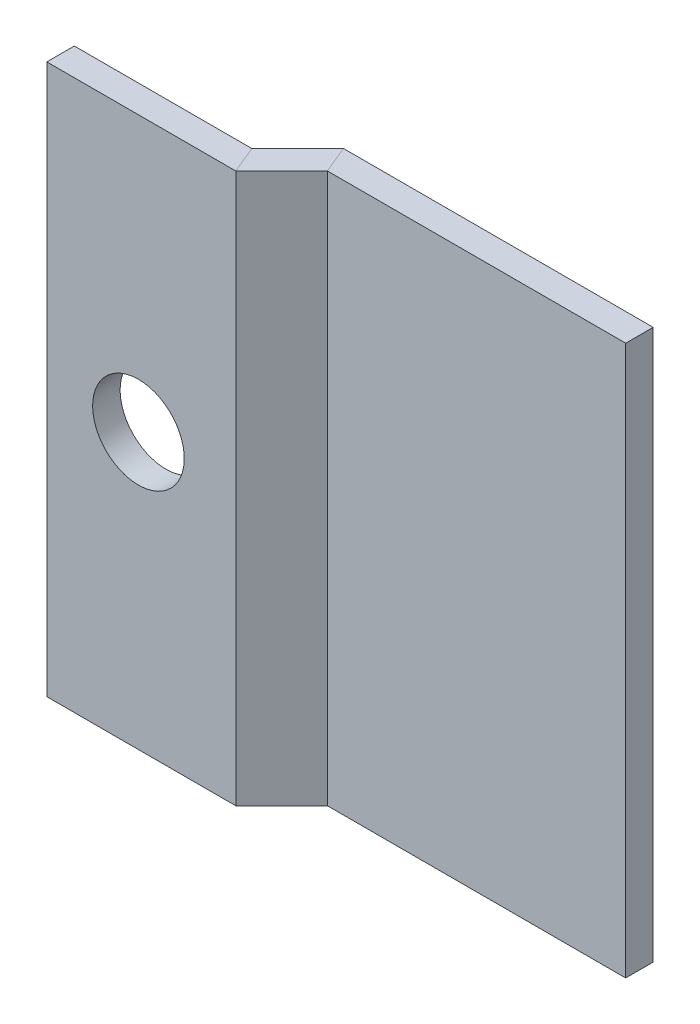
ISO-10303-21;
HEADER;
FILE_DESCRIPTION(('STEP AP214'),'2;1');
FILE_NAME('part.step','',(''),(''),'','','');
FILE_SCHEMA(('AUTOMOTIVE_DESIGN { 1 0 10303 214 1 1 1 1 }'));
ENDSEC;
DATA;
#1=APPLICATION_CONTEXT('core data for automotive mechanical design processes');
#2=APPLICATION_PROTOCOL_DEFINITION('international standard','automotive_design',2000,#1);
#3=PRODUCT_CONTEXT('',#1,'mechanical');
#4=PRODUCT('Part','Part','',(#3));
#5=PRODUCT_RELATED_PRODUCT_CATEGORY('part','',(#4));
#6=PRODUCT_DEFINITION_FORMATION('','',#4);
#7=PRODUCT_DEFINITION_CONTEXT('part definition',#1,'design');
#8=PRODUCT_DEFINITION('design','',#6,#7);
#9=PRODUCT_DEFINITION_SHAPE('','',#8);
#10=(LENGTH_UNIT() NAMED_UNIT(*) SI_UNIT(.MILLI.,.METRE.));
#11=(NAMED_UNIT(*) PLANE_ANGLE_UNIT() SI_UNIT($,.RADIAN.));
#12=(NAMED_UNIT(*) SI_UNIT($,.STERADIAN.) SOLID_ANGLE_UNIT());
#13=UNCERTAINTY_MEASURE_WITH_UNIT(LENGTH_MEASURE(1.E-05),#10,'distance_accuracy_value','');
#14=(GEOMETRIC_REPRESENTATION_CONTEXT(3) GLOBAL_UNCERTAINTY_ASSIGNED_CONTEXT((#13)) GLOBAL_UNIT_ASSIGNED_CONTEXT((#10,
#11,#12)) REPRESENTATION_CONTEXT('',''));
#15=CARTESIAN_POINT('',(0.,0.,0.));
#16=DIRECTION('',(0.,0.,1.));
#17=DIRECTION('',(1.,0.,0.));
#18=AXIS2_PLACEMENT_3D('',#15,#16,#17);
#19=CARTESIAN_POINT('',(11.6355449657061,0.,-1.));
#20=DIRECTION('',(1.,0.,0.));
#21=DIRECTION('',(0.,0.,-1.));
#22=AXIS2_PLACEMENT_3D('',#19,#20,#21);
#23=PLANE('',#22);
#24=DIRECTION('',(0.,1.,0.));
#25=VECTOR('',#24,1.);
#26=CARTESIAN_POINT('',(11.6355449657061,5.99999999999999,-1.3));
#27=LINE('',#26,#25);
#28=CARTESIAN_POINT('',(11.6355449657061,-6.00000000000001,-1.3));
#29=VERTEX_POINT('',#28);
#30=CARTESIAN_POINT('',(11.6355449657061,5.99999999999999,-1.3));
#31=VERTEX_POINT('',#30);
#32=EDGE_CURVE('E84',#29,#31,#27,.T.);
#33=ORIENTED_EDGE('',*,*,#32,.T.);
#34=DIRECTION('',(0.,0.,1.));
#35=VECTOR('',#34,1.);
#36=CARTESIAN_POINT('',(11.6355449657061,5.99999999999999,-0.7));
#37=LINE('',#36,#35);
#38=CARTESIAN_POINT('',(11.6355449657061,5.99999999999999,-0.7));
#39=VERTEX_POINT('',#38);
#40=EDGE_CURVE('E82',#31,#39,#37,.T.);
#41=ORIENTED_EDGE('',*,*,#40,.T.);
#42=DIRECTION('',(0.,-1.,0.));
#43=VECTOR('',#42,1.);
#44=CARTESIAN_POINT('',(11.6355449657061,5.99999999999999,-0.7));
#45=LINE('',#44,#43);
#46=CARTESIAN_POINT('',(11.6355449657061,-6.00000000000001,-0.700000000000001));
#47=VERTEX_POINT('',#46);
#48=EDGE_CURVE('E79',#39,#47,#45,.T.);
#49=ORIENTED_EDGE('',*,*,#48,.T.);
#50=DIRECTION('',(0.,0.,-1.));
#51=VECTOR('',#50,1.);
#52=CARTESIAN_POINT('',(11.6355449657061,-6.00000000000001,-0.700000000000001));
#53=LINE('',#52,#51);
#54=EDGE_CURVE('E99',#47,#29,#53,.T.);
#55=ORIENTED_EDGE('',*,*,#54,.T.);
#56=EDGE_LOOP('',(#33,#41,#49,#55));
#57=FACE_BOUND('',#56,.T.);
#58=ADVANCED_FACE('F33',(#57),#23,.T.);
#59=CARTESIAN_POINT('',(0.,0.,0.));
#60=DIRECTION('',(1.,0.,0.));
#61=DIRECTION('',(0.,0.,-1.));
#62=AXIS2_PLACEMENT_3D('',#59,#60,#61);
#63=PLANE('',#62);
#64=DIRECTION('',(0.,1.,0.));
#65=VECTOR('',#64,1.);
#66=CARTESIAN_POINT('',(0.,5.99999999999999,-0.299999999999999));
#67=LINE('',#66,#65);
#68=CARTESIAN_POINT('',(0.,-6.00000000000001,-0.300000000000001));
#69=VERTEX_POINT('',#68);
#70=CARTESIAN_POINT('',(0.,5.99999999999999,-0.299999999999999));
#71=VERTEX_POINT('',#70);
#72=EDGE_CURVE('E141',#69,#71,#67,.T.);
#73=ORIENTED_EDGE('',*,*,#72,.F.);
#74=DIRECTION('',(0.,0.,-1.));
#75=VECTOR('',#74,1.);
#76=CARTESIAN_POINT('',(0.,-6.00000000000001,0.299999999999999));
#77=LINE('',#76,#75);
#78=CARTESIAN_POINT('',(0.,-6.00000000000001,0.299999999999999));
#79=VERTEX_POINT('',#78);
#80=EDGE_CURVE('E147',#79,#69,#77,.T.);
#81=ORIENTED_EDGE('',*,*,#80,.F.);
#82=DIRECTION('',(0.,-1.,0.));
#83=VECTOR('',#82,1.);
#84=CARTESIAN_POINT('',(0.,5.99999999999999,0.3));
#85=LINE('',#84,#83);
#86=CARTESIAN_POINT('',(0.,5.99999999999999,0.3));
#87=VERTEX_POINT('',#86);
#88=EDGE_CURVE('E131',#87,#79,#85,.T.);
#89=ORIENTED_EDGE('',*,*,#88,.F.);
#90=DIRECTION('',(0.,0.,1.));
#91=VECTOR('',#90,1.);
#92=CARTESIAN_POINT('',(0.,5.99999999999999,0.3));
#93=LINE('',#92,#91);
#94=EDGE_CURVE('E137',#71,#87,#93,.T.);
#95=ORIENTED_EDGE('',*,*,#94,.F.);
#96=EDGE_LOOP('',(#73,#81,#89,#95));
#97=FACE_BOUND('',#96,.T.);
#98=ADVANCED_FACE('F212',(#97),#63,.F.);
#99=CARTESIAN_POINT('',(4.76330952441688,5.99999999999999,-0.7));
#100=DIRECTION('',(0.,0.,1.));
#101=DIRECTION('',(0.,-1.,0.));
#102=AXIS2_PLACEMENT_3D('',#99,#100,#101);
#103=PLANE('',#102);
#104=DIRECTION('',(0.,1.,0.));
#105=VECTOR('',#104,1.);
#106=CARTESIAN_POINT('',(5.12426406871193,5.99999999999999,-0.7));
#107=LINE('',#106,#105);
#108=CARTESIAN_POINT('',(5.12426406871193,-6.00000000000001,-0.700000000000001));
#109=VERTEX_POINT('',#108);
#110=CARTESIAN_POINT('',(5.12426406871193,5.99999999999999,-0.7));
#111=VERTEX_POINT('',#110);
#112=EDGE_CURVE('E115',#109,#111,#107,.T.);
#113=ORIENTED_EDGE('',*,*,#112,.F.);
#114=DIRECTION('',(1.,0.,0.));
#115=VECTOR('',#114,1.);
#116=CARTESIAN_POINT('',(4.76330952441688,-6.00000000000001,-0.700000000000001));
#117=LINE('',#116,#115);
#118=EDGE_CURVE('E97',#109,#47,#117,.T.);
#119=ORIENTED_EDGE('',*,*,#118,.T.);
#120=ORIENTED_EDGE('',*,*,#48,.F.);
#121=DIRECTION('',(1.,0.,0.));
#122=VECTOR('',#121,1.);
#123=CARTESIAN_POINT('',(4.76330952441688,5.99999999999999,-0.7));
#124=LINE('',#123,#122);
#125=EDGE_CURVE('E36',#111,#39,#124,.T.);
#126=ORIENTED_EDGE('',*,*,#125,.F.);
#127=EDGE_LOOP('',(#113,#119,#120,#126));
#128=FACE_BOUND('',#127,.T.);
#129=ADVANCED_FACE('F94',(#128),#103,.T.);
#130=CARTESIAN_POINT('',(4.76330952441688,-6.00000000000001,-0.700000000000001));
#131=DIRECTION('',(0.,-1.,0.));
#132=DIRECTION('',(0.,0.,-1.));
#133=AXIS2_PLACEMENT_3D('',#130,#131,#132);
#134=PLANE('',#133);
#135=DIRECTION('',(0.38268343236509,0.,0.923879532511287));
#136=VECTOR('',#135,1.);
#137=CARTESIAN_POINT('',(5.34783531599254,-6.00000000000001,-0.160251262658471));
#138=LINE('',#137,#136);
#139=CARTESIAN_POINT('',(4.87573593128807,-6.00000000000001,-1.3));
#140=VERTEX_POINT('',#139);
#141=EDGE_CURVE('E128',#140,#109,#138,.T.);
#142=ORIENTED_EDGE('',*,*,#141,.F.);
#143=DIRECTION('',(1.,0.,0.));
#144=VECTOR('',#143,1.);
#145=CARTESIAN_POINT('',(4.76330952441688,-6.00000000000001,-1.3));
#146=LINE('',#145,#144);
#147=EDGE_CURVE('E108',#140,#29,#146,.T.);
#148=ORIENTED_EDGE('',*,*,#147,.T.);
#149=ORIENTED_EDGE('',*,*,#54,.F.);
#150=ORIENTED_EDGE('',*,*,#118,.F.);
#151=EDGE_LOOP('',(#142,#148,#149,#150));
#152=FACE_BOUND('',#151,.T.);
#153=ADVANCED_FACE('F218',(#152),#134,.T.);
#154=CARTESIAN_POINT('',(4.76330952441688,5.99999999999999,-1.3));
#155=DIRECTION('',(0.,0.,-1.));
#156=DIRECTION('',(0.,1.,0.));
#157=AXIS2_PLACEMENT_3D('',#154,#155,#156);
#158=PLANE('',#157);
#159=DIRECTION('',(0.,-1.,0.));
#160=VECTOR('',#159,1.);
#161=CARTESIAN_POINT('',(4.87573593128807,5.99999999999999,-1.3));
#162=LINE('',#161,#160);
#163=CARTESIAN_POINT('',(4.87573593128807,5.99999999999999,-1.3));
#164=VERTEX_POINT('',#163);
#165=EDGE_CURVE('E125',#164,#140,#162,.T.);
#166=ORIENTED_EDGE('',*,*,#165,.F.);
#167=DIRECTION('',(1.,0.,0.));
#168=VECTOR('',#167,1.);
#169=CARTESIAN_POINT('',(4.76330952441688,5.99999999999999,-1.3));
#170=LINE('',#169,#168);
#171=EDGE_CURVE('E98',#164,#31,#170,.T.);
#172=ORIENTED_EDGE('',*,*,#171,.T.);
#173=ORIENTED_EDGE('',*,*,#32,.F.);
#174=ORIENTED_EDGE('',*,*,#147,.F.);
#175=EDGE_LOOP('',(#166,#172,#173,#174));
#176=FACE_BOUND('',#175,.T.);
#177=ADVANCED_FACE('F243',(#176),#158,.T.);
#178=CARTESIAN_POINT('',(4.76330952441688,5.99999999999999,-0.7));
#179=DIRECTION('',(0.,1.,0.));
#180=DIRECTION('',(0.,0.,1.));
#181=AXIS2_PLACEMENT_3D('',#178,#179,#180);
#182=PLANE('',#181);
#183=DIRECTION('',(-0.38268343236509,0.,-0.923879532511287));
#184=VECTOR('',#183,1.);
#185=CARTESIAN_POINT('',(5.34783531599254,5.99999999999999,-0.16025126265847));
#186=LINE('',#185,#184);
#187=EDGE_CURVE('E103',#111,#164,#186,.T.);
#188=ORIENTED_EDGE('',*,*,#187,.F.);
#189=ORIENTED_EDGE('',*,*,#125,.T.);
#190=ORIENTED_EDGE('',*,*,#40,.F.);
#191=ORIENTED_EDGE('',*,*,#171,.F.);
#192=EDGE_LOOP('',(#188,#189,#190,#191));
#193=FACE_BOUND('',#192,.T.);
#194=ADVANCED_FACE('F101',(#193),#182,.T.);
#195=CARTESIAN_POINT('',(4.04476659402887,5.99999999999999,0.379497474683059));
#196=DIRECTION('',(0.,1.,0.));
#197=DIRECTION('',(0.,0.,1.));
#198=AXIS2_PLACEMENT_3D('',#195,#196,#197);
#199=PLANE('',#198);
#200=DIRECTION('',(0.707106781186547,0.,-0.707106781186547));
#201=VECTOR('',#200,1.);
#202=CARTESIAN_POINT('',(4.04476659402887,5.99999999999999,0.379497474683059));
#203=LINE('',#202,#201);
#204=CARTESIAN_POINT('',(4.12426406871193,5.99999999999999,0.300000000000001));
#205=VERTEX_POINT('',#204);
#206=EDGE_CURVE('E117',#205,#111,#203,.T.);
#207=ORIENTED_EDGE('',*,*,#206,.T.);
#208=ORIENTED_EDGE('',*,*,#187,.T.);
#209=DIRECTION('',(0.707106781186547,0.,-0.707106781186547));
#210=VECTOR('',#209,1.);
#211=CARTESIAN_POINT('',(3.62050252531694,5.99999999999999,-0.0447665940288696));
#212=LINE('',#211,#210);
#213=CARTESIAN_POINT('',(3.87573593128807,5.99999999999999,-0.299999999999999));
#214=VERTEX_POINT('',#213);
#215=EDGE_CURVE('E104',#214,#164,#212,.T.);
#216=ORIENTED_EDGE('',*,*,#215,.F.);
#217=DIRECTION('',(-0.38268343236509,0.,-0.923879532511287));
#218=VECTOR('',#217,1.);
#219=CARTESIAN_POINT('',(3.52027957955108,5.99999999999999,-1.15814754519511));
#220=LINE('',#219,#218);
#221=EDGE_CURVE('E135',#205,#214,#220,.T.);
#222=ORIENTED_EDGE('',*,*,#221,.F.);
#223=EDGE_LOOP('',(#207,#208,#216,#222));
#224=FACE_BOUND('',#223,.T.);
#225=ADVANCED_FACE('F205',(#224),#199,.T.);
#226=CARTESIAN_POINT('',(3.62050252531694,5.99999999999999,-0.0447665940288696));
#227=DIRECTION('',(-0.707106781186548,0.,-0.707106781186548));
#228=DIRECTION('',(-0.707106781186548,0.,0.707106781186548));
#229=AXIS2_PLACEMENT_3D('',#226,#227,#228);
#230=PLANE('',#229);
#231=ORIENTED_EDGE('',*,*,#215,.T.);
#232=ORIENTED_EDGE('',*,*,#165,.T.);
#233=DIRECTION('',(0.707106781186547,0.,-0.707106781186547));
#234=VECTOR('',#233,1.);
#235=CARTESIAN_POINT('',(3.62050252531694,-6.00000000000001,-0.0447665940288708));
#236=LINE('',#235,#234);
#237=CARTESIAN_POINT('',(3.87573593128807,-6.00000000000001,-0.300000000000001));
#238=VERTEX_POINT('',#237);
#239=EDGE_CURVE('E106',#238,#140,#236,.T.);
#240=ORIENTED_EDGE('',*,*,#239,.F.);
#241=DIRECTION('',(0.,-1.,0.));
#242=VECTOR('',#241,1.);
#243=CARTESIAN_POINT('',(3.87573593128807,5.99999999999999,-0.299999999999999));
#244=LINE('',#243,#242);
#245=EDGE_CURVE('E42',#214,#238,#244,.T.);
#246=ORIENTED_EDGE('',*,*,#245,.F.);
#247=EDGE_LOOP('',(#231,#232,#240,#246));
#248=FACE_BOUND('',#247,.T.);
#249=ADVANCED_FACE('F235',(#248),#230,.T.);
#250=CARTESIAN_POINT('',(4.04476659402887,-6.00000000000001,0.379497474683058));
#251=DIRECTION('',(0.,-1.,0.));
#252=DIRECTION('',(0.,0.,-1.));
#253=AXIS2_PLACEMENT_3D('',#250,#251,#252);
#254=PLANE('',#253);
#255=ORIENTED_EDGE('',*,*,#239,.T.);
#256=ORIENTED_EDGE('',*,*,#141,.T.);
#257=DIRECTION('',(0.707106781186547,0.,-0.707106781186547));
#258=VECTOR('',#257,1.);
#259=CARTESIAN_POINT('',(4.04476659402887,-6.00000000000001,0.379497474683058));
#260=LINE('',#259,#258);
#261=CARTESIAN_POINT('',(4.12426406871193,-6.00000000000001,0.299999999999999));
#262=VERTEX_POINT('',#261);
#263=EDGE_CURVE('E120',#262,#109,#260,.T.);
#264=ORIENTED_EDGE('',*,*,#263,.F.);
#265=DIRECTION('',(0.38268343236509,0.,0.923879532511287));
#266=VECTOR('',#265,1.);
#267=CARTESIAN_POINT('',(3.52027957955108,-6.00000000000001,-1.15814754519511));
#268=LINE('',#267,#266);
#269=EDGE_CURVE('E11',#238,#262,#268,.T.);
#270=ORIENTED_EDGE('',*,*,#269,.F.);
#271=EDGE_LOOP('',(#255,#256,#264,#270));
#272=FACE_BOUND('',#271,.T.);
#273=ADVANCED_FACE('F232',(#272),#254,.T.);
#274=CARTESIAN_POINT('',(4.04476659402887,5.99999999999999,0.379497474683059));
#275=DIRECTION('',(0.707106781186548,0.,0.707106781186548));
#276=DIRECTION('',(0.707106781186548,0.,-0.707106781186548));
#277=AXIS2_PLACEMENT_3D('',#274,#275,#276);
#278=PLANE('',#277);
#279=ORIENTED_EDGE('',*,*,#263,.T.);
#280=ORIENTED_EDGE('',*,*,#112,.T.);
#281=ORIENTED_EDGE('',*,*,#206,.F.);
#282=DIRECTION('',(0.,1.,0.));
#283=VECTOR('',#282,1.);
#284=CARTESIAN_POINT('',(4.12426406871193,5.99999999999999,0.3));
#285=LINE('',#284,#283);
#286=EDGE_CURVE('E132',#262,#205,#285,.T.);
#287=ORIENTED_EDGE('',*,*,#286,.F.);
#288=EDGE_LOOP('',(#279,#280,#281,#287));
#289=FACE_BOUND('',#288,.T.);
#290=ADVANCED_FACE('F207',(#289),#278,.T.);
#291=CARTESIAN_POINT('',(0.,5.99999999999999,0.3));
#292=DIRECTION('',(0.,1.,0.));
#293=DIRECTION('',(0.,0.,1.));
#294=AXIS2_PLACEMENT_3D('',#291,#292,#293);
#295=PLANE('',#294);
#296=DIRECTION('',(1.,0.,0.));
#297=VECTOR('',#296,1.);
#298=CARTESIAN_POINT('',(0.,5.99999999999999,0.3));
#299=LINE('',#298,#297);
#300=EDGE_CURVE('E140',#87,#205,#299,.T.);
#301=ORIENTED_EDGE('',*,*,#300,.T.);
#302=ORIENTED_EDGE('',*,*,#221,.T.);
#303=DIRECTION('',(1.,0.,0.));
#304=VECTOR('',#303,1.);
#305=CARTESIAN_POINT('',(0.,5.99999999999999,-0.299999999999999));
#306=LINE('',#305,#304);
#307=EDGE_CURVE('E136',#71,#214,#306,.T.);
#308=ORIENTED_EDGE('',*,*,#307,.F.);
#309=ORIENTED_EDGE('',*,*,#94,.T.);
#310=EDGE_LOOP('',(#301,#302,#308,#309));
#311=FACE_BOUND('',#310,.T.);
#312=ADVANCED_FACE('F182',(#311),#295,.T.);
#313=CARTESIAN_POINT('',(0.,5.99999999999999,-0.299999999999999));
#314=DIRECTION('',(0.,0.,-1.));
#315=DIRECTION('',(0.,1.,0.));
#316=AXIS2_PLACEMENT_3D('',#313,#314,#315);
#317=PLANE('',#316);
#318=CARTESIAN_POINT('',(2.,0.,-0.3));
#319=DIRECTION('',(0.,0.,-1.));
#320=DIRECTION('',(0.,1.,0.));
#321=AXIS2_PLACEMENT_3D('',#318,#319,#320);
#322=CIRCLE('',#321,1.);
#323=CARTESIAN_POINT('',(2.,1.,-0.3));
#324=VERTEX_POINT('',#323);
#325=EDGE_CURVE('E163',#324,#324,#322,.T.);
#326=ORIENTED_EDGE('',*,*,#325,.F.);
#327=EDGE_LOOP('',(#326));
#328=FACE_BOUND('',#327,.T.);
#329=ORIENTED_EDGE('',*,*,#307,.T.);
#330=ORIENTED_EDGE('',*,*,#245,.T.);
#331=DIRECTION('',(1.,0.,0.));
#332=VECTOR('',#331,1.);
#333=CARTESIAN_POINT('',(0.,-6.00000000000001,-0.300000000000001));
#334=LINE('',#333,#332);
#335=EDGE_CURVE('E144',#69,#238,#334,.T.);
#336=ORIENTED_EDGE('',*,*,#335,.F.);
#337=ORIENTED_EDGE('',*,*,#72,.T.);
#338=EDGE_LOOP('',(#329,#330,#336,#337));
#339=FACE_BOUND('',#338,.T.);
#340=ADVANCED_FACE('F178',(#328,#339),#317,.T.);
#341=CARTESIAN_POINT('',(0.,-6.00000000000001,0.299999999999999));
#342=DIRECTION('',(0.,-1.,0.));
#343=DIRECTION('',(0.,0.,-1.));
#344=AXIS2_PLACEMENT_3D('',#341,#342,#343);
#345=PLANE('',#344);
#346=ORIENTED_EDGE('',*,*,#335,.T.);
#347=ORIENTED_EDGE('',*,*,#269,.T.);
#348=DIRECTION('',(1.,0.,0.));
#349=VECTOR('',#348,1.);
#350=CARTESIAN_POINT('',(0.,-6.00000000000001,0.299999999999999));
#351=LINE('',#350,#349);
#352=EDGE_CURVE('E150',#79,#262,#351,.T.);
#353=ORIENTED_EDGE('',*,*,#352,.F.);
#354=ORIENTED_EDGE('',*,*,#80,.T.);
#355=EDGE_LOOP('',(#346,#347,#353,#354));
#356=FACE_BOUND('',#355,.T.);
#357=ADVANCED_FACE('F181',(#356),#345,.T.);
#358=CARTESIAN_POINT('',(0.,5.99999999999999,0.3));
#359=DIRECTION('',(0.,0.,1.));
#360=DIRECTION('',(0.,-1.,0.));
#361=AXIS2_PLACEMENT_3D('',#358,#359,#360);
#362=PLANE('',#361);
#363=CARTESIAN_POINT('',(2.,0.,0.3));
#364=DIRECTION('',(0.,0.,-1.));
#365=DIRECTION('',(0.,1.,0.));
#366=AXIS2_PLACEMENT_3D('',#363,#364,#365);
#367=CIRCLE('',#366,1.);
#368=CARTESIAN_POINT('',(2.,1.,0.3));
#369=VERTEX_POINT('',#368);
#370=EDGE_CURVE('E89',#369,#369,#367,.T.);
#371=ORIENTED_EDGE('',*,*,#370,.T.);
#372=EDGE_LOOP('',(#371));
#373=FACE_BOUND('',#372,.T.);
#374=ORIENTED_EDGE('',*,*,#352,.T.);
#375=ORIENTED_EDGE('',*,*,#286,.T.);
#376=ORIENTED_EDGE('',*,*,#300,.F.);
#377=ORIENTED_EDGE('',*,*,#88,.T.);
#378=EDGE_LOOP('',(#374,#375,#376,#377));
#379=FACE_BOUND('',#378,.T.);
#380=ADVANCED_FACE('F169',(#373,#379),#362,.T.);
#381=CARTESIAN_POINT('',(2.,0.,0.3));
#382=DIRECTION('',(0.,0.,-1.));
#383=DIRECTION('',(0.,1.,0.));
#384=AXIS2_PLACEMENT_3D('',#381,#382,#383);
#385=CYLINDRICAL_SURFACE('',#384,1.);
#386=ORIENTED_EDGE('',*,*,#370,.F.);
#387=EDGE_LOOP('',(#386));
#388=FACE_BOUND('',#387,.T.);
#389=ORIENTED_EDGE('',*,*,#325,.T.);
#390=EDGE_LOOP('',(#389));
#391=FACE_BOUND('',#390,.T.);
#392=ADVANCED_FACE('F172',(#388,#391),#385,.F.);
#393=CLOSED_SHELL('',(#58,#98,#129,#153,#177,#194,#225,#249,#273,#290,#312,#340,#357,#380,#392));
#394=MANIFOLD_SOLID_BREP('B2',#393);
#395=ADVANCED_BREP_SHAPE_REPRESENTATION('',(#18,#394),#14);
#396=SHAPE_DEFINITION_REPRESENTATION(#9,#395);
ENDSEC;
END-ISO-10303-21;
